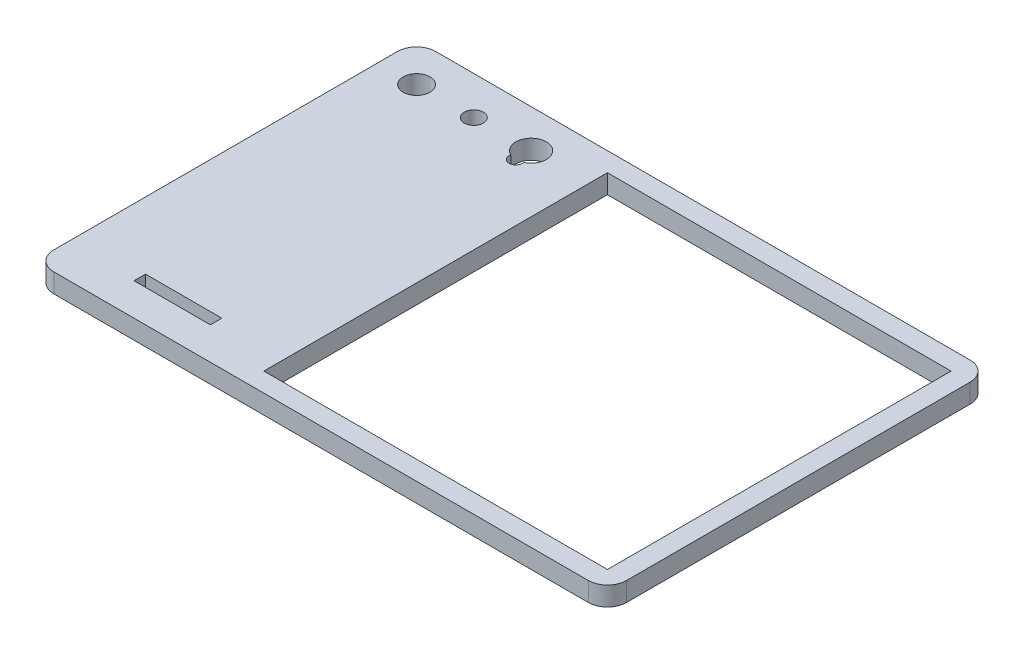
ISO-10303-21;
HEADER;
FILE_DESCRIPTION(('STEP AP214'),'2;1');
FILE_NAME('part.step','',(''),(''),'','','');
FILE_SCHEMA(('AUTOMOTIVE_DESIGN { 1 0 10303 214 1 1 1 1 }'));
ENDSEC;
DATA;
#1=APPLICATION_CONTEXT('core data for automotive mechanical design processes');
#2=APPLICATION_PROTOCOL_DEFINITION('international standard','automotive_design',2000,#1);
#3=PRODUCT_CONTEXT('',#1,'mechanical');
#4=PRODUCT('Part','Part','',(#3));
#5=PRODUCT_RELATED_PRODUCT_CATEGORY('part','',(#4));
#6=PRODUCT_DEFINITION_FORMATION('','',#4);
#7=PRODUCT_DEFINITION_CONTEXT('part definition',#1,'design');
#8=PRODUCT_DEFINITION('design','',#6,#7);
#9=PRODUCT_DEFINITION_SHAPE('','',#8);
#10=(LENGTH_UNIT() NAMED_UNIT(*) SI_UNIT(.MILLI.,.METRE.));
#11=(NAMED_UNIT(*) PLANE_ANGLE_UNIT() SI_UNIT($,.RADIAN.));
#12=(NAMED_UNIT(*) SI_UNIT($,.STERADIAN.) SOLID_ANGLE_UNIT());
#13=UNCERTAINTY_MEASURE_WITH_UNIT(LENGTH_MEASURE(1.E-05),#10,'distance_accuracy_value','');
#14=(GEOMETRIC_REPRESENTATION_CONTEXT(3) GLOBAL_UNCERTAINTY_ASSIGNED_CONTEXT((#13)) GLOBAL_UNIT_ASSIGNED_CONTEXT((#10,
#11,#12)) REPRESENTATION_CONTEXT('',''));
#15=CARTESIAN_POINT('',(0.,0.,0.));
#16=DIRECTION('',(0.,0.,1.));
#17=DIRECTION('',(1.,0.,0.));
#18=AXIS2_PLACEMENT_3D('',#15,#16,#17);
#19=CARTESIAN_POINT('',(0.,5.,0.));
#20=DIRECTION('',(0.,-1.,0.));
#21=DIRECTION('',(0.,0.,-1.));
#22=AXIS2_PLACEMENT_3D('',#19,#20,#21);
#23=PLANE('',#22);
#24=CARTESIAN_POINT('',(-65.,5.,-40.));
#25=DIRECTION('',(0.,1.,0.));
#26=DIRECTION('',(0.,0.,1.));
#27=AXIS2_PLACEMENT_3D('',#24,#25,#26);
#28=CIRCLE('',#27,3.5);
#29=CARTESIAN_POINT('',(-65.,5.,-36.5));
#30=VERTEX_POINT('',#29);
#31=EDGE_CURVE('E504',#30,#30,#28,.T.);
#32=ORIENTED_EDGE('',*,*,#31,.F.);
#33=EDGE_LOOP('',(#32));
#34=FACE_BOUND('',#33,.T.);
#35=CARTESIAN_POINT('',(-50.,5.,-40.));
#36=DIRECTION('',(0.,1.,0.));
#37=DIRECTION('',(0.,0.,1.));
#38=AXIS2_PLACEMENT_3D('',#35,#36,#37);
#39=CIRCLE('',#38,2.5);
#40=CARTESIAN_POINT('',(-50.,5.,-37.5));
#41=VERTEX_POINT('',#40);
#42=EDGE_CURVE('E178',#41,#41,#39,.T.);
#43=ORIENTED_EDGE('',*,*,#42,.F.);
#44=EDGE_LOOP('',(#43));
#45=FACE_BOUND('',#44,.T.);
#46=CARTESIAN_POINT('',(-35.,5.,-36.));
#47=DIRECTION('',(0.,1.,0.));
#48=DIRECTION('',(0.,0.,1.));
#49=AXIS2_PLACEMENT_3D('',#46,#47,#48);
#50=CIRCLE('',#49,1.75);
#51=CARTESIAN_POINT('',(-36.7076166401871,5.,-36.3828125));
#52=VERTEX_POINT('',#51);
#53=CARTESIAN_POINT('',(-33.2923833598129,5.,-36.3828125));
#54=VERTEX_POINT('',#53);
#55=EDGE_CURVE('E174',#52,#54,#50,.T.);
#56=ORIENTED_EDGE('',*,*,#55,.F.);
#57=CARTESIAN_POINT('',(-35.,5.,-40.));
#58=DIRECTION('',(0.,1.,0.));
#59=DIRECTION('',(0.,0.,1.));
#60=AXIS2_PLACEMENT_3D('',#57,#58,#59);
#61=CIRCLE('',#60,4.);
#62=EDGE_CURVE('E49',#54,#52,#61,.T.);
#63=ORIENTED_EDGE('',*,*,#62,.F.);
#64=EDGE_LOOP('',(#56,#63));
#65=FACE_BOUND('',#64,.T.);
#66=DIRECTION('',(0.,0.,-1.));
#67=VECTOR('',#66,1.);
#68=CARTESIAN_POINT('',(-37.5,5.,0.));
#69=LINE('',#68,#67);
#70=CARTESIAN_POINT('',(-37.5,5.,41.5));
#71=VERTEX_POINT('',#70);
#72=CARTESIAN_POINT('',(-37.5,5.,38.5));
#73=VERTEX_POINT('',#72);
#74=EDGE_CURVE('E198',#71,#73,#69,.T.);
#75=ORIENTED_EDGE('',*,*,#74,.F.);
#76=DIRECTION('',(1.,0.,0.));
#77=VECTOR('',#76,1.);
#78=CARTESIAN_POINT('',(0.,5.,41.5));
#79=LINE('',#78,#77);
#80=CARTESIAN_POINT('',(-57.5,5.,41.5));
#81=VERTEX_POINT('',#80);
#82=EDGE_CURVE('E57',#81,#71,#79,.T.);
#83=ORIENTED_EDGE('',*,*,#82,.F.);
#84=DIRECTION('',(0.,0.,-1.));
#85=VECTOR('',#84,1.);
#86=CARTESIAN_POINT('',(-57.5,5.,0.));
#87=LINE('',#86,#85);
#88=CARTESIAN_POINT('',(-57.5,5.,38.5));
#89=VERTEX_POINT('',#88);
#90=EDGE_CURVE('E188',#81,#89,#87,.T.);
#91=ORIENTED_EDGE('',*,*,#90,.T.);
#92=DIRECTION('',(1.,0.,0.));
#93=VECTOR('',#92,1.);
#94=CARTESIAN_POINT('',(0.,5.,38.5));
#95=LINE('',#94,#93);
#96=EDGE_CURVE('E201',#89,#73,#95,.T.);
#97=ORIENTED_EDGE('',*,*,#96,.T.);
#98=EDGE_LOOP('',(#75,#83,#91,#97));
#99=FACE_BOUND('',#98,.T.);
#100=DIRECTION('',(0.,0.,-1.));
#101=VECTOR('',#100,1.);
#102=CARTESIAN_POINT('',(75.,5.,50.));
#103=LINE('',#102,#101);
#104=CARTESIAN_POINT('',(75.,5.,45.));
#105=VERTEX_POINT('',#104);
#106=CARTESIAN_POINT('',(75.,5.,-45.));
#107=VERTEX_POINT('',#106);
#108=EDGE_CURVE('E245',#105,#107,#103,.T.);
#109=ORIENTED_EDGE('',*,*,#108,.T.);
#110=CARTESIAN_POINT('',(70.,5.,-45.));
#111=DIRECTION('',(0.,-1.,0.));
#112=DIRECTION('',(0.,0.,-1.));
#113=AXIS2_PLACEMENT_3D('',#110,#111,#112);
#114=CIRCLE('',#113,5.);
#115=CARTESIAN_POINT('',(70.,5.,-50.));
#116=VERTEX_POINT('',#115);
#117=EDGE_CURVE('E292',#107,#116,#114,.F.);
#118=ORIENTED_EDGE('',*,*,#117,.T.);
#119=DIRECTION('',(-1.,0.,0.));
#120=VECTOR('',#119,1.);
#121=CARTESIAN_POINT('',(-75.,5.,-50.));
#122=LINE('',#121,#120);
#123=CARTESIAN_POINT('',(-70.,5.,-50.));
#124=VERTEX_POINT('',#123);
#125=EDGE_CURVE('E248',#116,#124,#122,.T.);
#126=ORIENTED_EDGE('',*,*,#125,.T.);
#127=CARTESIAN_POINT('',(-70.,5.,-45.));
#128=DIRECTION('',(0.,-1.,0.));
#129=DIRECTION('',(0.,0.,-1.));
#130=AXIS2_PLACEMENT_3D('',#127,#128,#129);
#131=CIRCLE('',#130,5.);
#132=CARTESIAN_POINT('',(-75.,5.,-45.));
#133=VERTEX_POINT('',#132);
#134=EDGE_CURVE('E290',#124,#133,#131,.F.);
#135=ORIENTED_EDGE('',*,*,#134,.T.);
#136=DIRECTION('',(0.,0.,1.));
#137=VECTOR('',#136,1.);
#138=CARTESIAN_POINT('',(-75.,5.,50.));
#139=LINE('',#138,#137);
#140=CARTESIAN_POINT('',(-75.,5.,45.));
#141=VERTEX_POINT('',#140);
#142=EDGE_CURVE('E252',#133,#141,#139,.T.);
#143=ORIENTED_EDGE('',*,*,#142,.T.);
#144=CARTESIAN_POINT('',(-70.,5.,45.));
#145=DIRECTION('',(0.,-1.,0.));
#146=DIRECTION('',(0.,0.,-1.));
#147=AXIS2_PLACEMENT_3D('',#144,#145,#146);
#148=CIRCLE('',#147,5.);
#149=CARTESIAN_POINT('',(-70.,5.,50.));
#150=VERTEX_POINT('',#149);
#151=EDGE_CURVE('E288',#141,#150,#148,.F.);
#152=ORIENTED_EDGE('',*,*,#151,.T.);
#153=DIRECTION('',(1.,0.,0.));
#154=VECTOR('',#153,1.);
#155=CARTESIAN_POINT('',(-75.,5.,50.));
#156=LINE('',#155,#154);
#157=CARTESIAN_POINT('',(70.,5.,50.));
#158=VERTEX_POINT('',#157);
#159=EDGE_CURVE('E255',#150,#158,#156,.T.);
#160=ORIENTED_EDGE('',*,*,#159,.T.);
#161=CARTESIAN_POINT('',(70.,5.,45.));
#162=DIRECTION('',(0.,-1.,0.));
#163=DIRECTION('',(0.,0.,-1.));
#164=AXIS2_PLACEMENT_3D('',#161,#162,#163);
#165=CIRCLE('',#164,5.);
#166=EDGE_CURVE('E286',#158,#105,#165,.F.);
#167=ORIENTED_EDGE('',*,*,#166,.T.);
#168=EDGE_LOOP('',(#109,#118,#126,#135,#143,#152,#160,#167));
#169=FACE_BOUND('',#168,.T.);
#170=DIRECTION('',(0.,0.,-1.));
#171=VECTOR('',#170,1.);
#172=CARTESIAN_POINT('',(70.,5.,-45.));
#173=LINE('',#172,#171);
#174=CARTESIAN_POINT('',(70.,5.,45.));
#175=VERTEX_POINT('',#174);
#176=CARTESIAN_POINT('',(70.,5.,-45.));
#177=VERTEX_POINT('',#176);
#178=EDGE_CURVE('E212',#175,#177,#173,.T.);
#179=ORIENTED_EDGE('',*,*,#178,.F.);
#180=DIRECTION('',(1.,0.,0.));
#181=VECTOR('',#180,1.);
#182=CARTESIAN_POINT('',(70.,5.,45.));
#183=LINE('',#182,#181);
#184=CARTESIAN_POINT('',(-20.,5.,45.));
#185=VERTEX_POINT('',#184);
#186=EDGE_CURVE('E220',#185,#175,#183,.T.);
#187=ORIENTED_EDGE('',*,*,#186,.F.);
#188=DIRECTION('',(0.,0.,1.));
#189=VECTOR('',#188,1.);
#190=CARTESIAN_POINT('',(-20.,5.,-45.));
#191=LINE('',#190,#189);
#192=CARTESIAN_POINT('',(-20.,5.,-45.));
#193=VERTEX_POINT('',#192);
#194=EDGE_CURVE('E217',#193,#185,#191,.T.);
#195=ORIENTED_EDGE('',*,*,#194,.F.);
#196=DIRECTION('',(-1.,0.,0.));
#197=VECTOR('',#196,1.);
#198=CARTESIAN_POINT('',(70.,5.,-45.));
#199=LINE('',#198,#197);
#200=EDGE_CURVE('E214',#177,#193,#199,.T.);
#201=ORIENTED_EDGE('',*,*,#200,.F.);
#202=EDGE_LOOP('',(#179,#187,#195,#201));
#203=FACE_BOUND('',#202,.T.);
#204=ADVANCED_FACE('F34',(#34,#45,#65,#99,#169,#203),#23,.F.);
#205=CARTESIAN_POINT('',(0.,0.,0.));
#206=DIRECTION('',(0.,-1.,0.));
#207=DIRECTION('',(0.,0.,-1.));
#208=AXIS2_PLACEMENT_3D('',#205,#206,#207);
#209=PLANE('',#208);
#210=CARTESIAN_POINT('',(-65.,0.,-40.));
#211=DIRECTION('',(0.,1.,0.));
#212=DIRECTION('',(0.,0.,1.));
#213=AXIS2_PLACEMENT_3D('',#210,#211,#212);
#214=CIRCLE('',#213,3.5);
#215=CARTESIAN_POINT('',(-65.,0.,-36.5));
#216=VERTEX_POINT('',#215);
#217=EDGE_CURVE('E227',#216,#216,#214,.T.);
#218=ORIENTED_EDGE('',*,*,#217,.T.);
#219=EDGE_LOOP('',(#218));
#220=FACE_BOUND('',#219,.T.);
#221=CARTESIAN_POINT('',(-50.,0.,-40.));
#222=DIRECTION('',(0.,1.,0.));
#223=DIRECTION('',(0.,0.,1.));
#224=AXIS2_PLACEMENT_3D('',#221,#222,#223);
#225=CIRCLE('',#224,2.5);
#226=CARTESIAN_POINT('',(-50.,0.,-37.5));
#227=VERTEX_POINT('',#226);
#228=EDGE_CURVE('E505',#227,#227,#225,.T.);
#229=ORIENTED_EDGE('',*,*,#228,.T.);
#230=EDGE_LOOP('',(#229));
#231=FACE_BOUND('',#230,.T.);
#232=CARTESIAN_POINT('',(-35.,0.,-40.));
#233=DIRECTION('',(0.,1.,0.));
#234=DIRECTION('',(0.,0.,1.));
#235=AXIS2_PLACEMENT_3D('',#232,#233,#234);
#236=CIRCLE('',#235,4.);
#237=CARTESIAN_POINT('',(-33.2923833598129,0.,-36.3828125));
#238=VERTEX_POINT('',#237);
#239=CARTESIAN_POINT('',(-36.7076166401871,0.,-36.3828125));
#240=VERTEX_POINT('',#239);
#241=EDGE_CURVE('E160',#238,#240,#236,.T.);
#242=ORIENTED_EDGE('',*,*,#241,.T.);
#243=CARTESIAN_POINT('',(-35.,0.,-36.));
#244=DIRECTION('',(0.,1.,0.));
#245=DIRECTION('',(0.,0.,1.));
#246=AXIS2_PLACEMENT_3D('',#243,#244,#245);
#247=CIRCLE('',#246,1.75);
#248=EDGE_CURVE('E166',#240,#238,#247,.T.);
#249=ORIENTED_EDGE('',*,*,#248,.T.);
#250=EDGE_LOOP('',(#242,#249));
#251=FACE_BOUND('',#250,.T.);
#252=DIRECTION('',(1.,0.,0.));
#253=VECTOR('',#252,1.);
#254=CARTESIAN_POINT('',(0.,0.,41.5));
#255=LINE('',#254,#253);
#256=CARTESIAN_POINT('',(-57.5,0.,41.5));
#257=VERTEX_POINT('',#256);
#258=CARTESIAN_POINT('',(-37.5,0.,41.5));
#259=VERTEX_POINT('',#258);
#260=EDGE_CURVE('E184',#257,#259,#255,.T.);
#261=ORIENTED_EDGE('',*,*,#260,.T.);
#262=DIRECTION('',(0.,0.,-1.));
#263=VECTOR('',#262,1.);
#264=CARTESIAN_POINT('',(-37.5,0.,0.));
#265=LINE('',#264,#263);
#266=CARTESIAN_POINT('',(-37.5,0.,38.5));
#267=VERTEX_POINT('',#266);
#268=EDGE_CURVE('E187',#259,#267,#265,.T.);
#269=ORIENTED_EDGE('',*,*,#268,.T.);
#270=DIRECTION('',(1.,0.,0.));
#271=VECTOR('',#270,1.);
#272=CARTESIAN_POINT('',(0.,0.,38.5));
#273=LINE('',#272,#271);
#274=CARTESIAN_POINT('',(-57.5,0.,38.5));
#275=VERTEX_POINT('',#274);
#276=EDGE_CURVE('E191',#275,#267,#273,.T.);
#277=ORIENTED_EDGE('',*,*,#276,.F.);
#278=DIRECTION('',(0.,0.,-1.));
#279=VECTOR('',#278,1.);
#280=CARTESIAN_POINT('',(-57.5,0.,0.));
#281=LINE('',#280,#279);
#282=EDGE_CURVE('E194',#257,#275,#281,.T.);
#283=ORIENTED_EDGE('',*,*,#282,.F.);
#284=EDGE_LOOP('',(#261,#269,#277,#283));
#285=FACE_BOUND('',#284,.T.);
#286=DIRECTION('',(-1.,0.,0.));
#287=VECTOR('',#286,1.);
#288=CARTESIAN_POINT('',(-75.,0.,-50.));
#289=LINE('',#288,#287);
#290=CARTESIAN_POINT('',(70.,0.,-50.));
#291=VERTEX_POINT('',#290);
#292=CARTESIAN_POINT('',(-70.,0.,-50.));
#293=VERTEX_POINT('',#292);
#294=EDGE_CURVE('E261',#291,#293,#289,.T.);
#295=ORIENTED_EDGE('',*,*,#294,.F.);
#296=CARTESIAN_POINT('',(70.,0.,-45.));
#297=DIRECTION('',(0.,-1.,0.));
#298=DIRECTION('',(0.,0.,-1.));
#299=AXIS2_PLACEMENT_3D('',#296,#297,#298);
#300=CIRCLE('',#299,5.);
#301=CARTESIAN_POINT('',(75.,0.,-45.));
#302=VERTEX_POINT('',#301);
#303=EDGE_CURVE('E279',#291,#302,#300,.T.);
#304=ORIENTED_EDGE('',*,*,#303,.T.);
#305=DIRECTION('',(0.,0.,-1.));
#306=VECTOR('',#305,1.);
#307=CARTESIAN_POINT('',(75.,0.,50.));
#308=LINE('',#307,#306);
#309=CARTESIAN_POINT('',(75.,0.,45.));
#310=VERTEX_POINT('',#309);
#311=EDGE_CURVE('E244',#310,#302,#308,.T.);
#312=ORIENTED_EDGE('',*,*,#311,.F.);
#313=CARTESIAN_POINT('',(70.,0.,45.));
#314=DIRECTION('',(0.,-1.,0.));
#315=DIRECTION('',(0.,0.,-1.));
#316=AXIS2_PLACEMENT_3D('',#313,#314,#315);
#317=CIRCLE('',#316,5.);
#318=CARTESIAN_POINT('',(70.,0.,50.));
#319=VERTEX_POINT('',#318);
#320=EDGE_CURVE('E273',#310,#319,#317,.T.);
#321=ORIENTED_EDGE('',*,*,#320,.T.);
#322=DIRECTION('',(1.,0.,0.));
#323=VECTOR('',#322,1.);
#324=CARTESIAN_POINT('',(-75.,0.,50.));
#325=LINE('',#324,#323);
#326=CARTESIAN_POINT('',(-70.,0.,50.));
#327=VERTEX_POINT('',#326);
#328=EDGE_CURVE('E249',#327,#319,#325,.T.);
#329=ORIENTED_EDGE('',*,*,#328,.F.);
#330=CARTESIAN_POINT('',(-70.,0.,45.));
#331=DIRECTION('',(0.,-1.,0.));
#332=DIRECTION('',(0.,0.,-1.));
#333=AXIS2_PLACEMENT_3D('',#330,#331,#332);
#334=CIRCLE('',#333,5.);
#335=CARTESIAN_POINT('',(-75.,0.,45.));
#336=VERTEX_POINT('',#335);
#337=EDGE_CURVE('E275',#327,#336,#334,.T.);
#338=ORIENTED_EDGE('',*,*,#337,.T.);
#339=DIRECTION('',(0.,0.,1.));
#340=VECTOR('',#339,1.);
#341=CARTESIAN_POINT('',(-75.,0.,50.));
#342=LINE('',#341,#340);
#343=CARTESIAN_POINT('',(-75.,0.,-45.));
#344=VERTEX_POINT('',#343);
#345=EDGE_CURVE('E264',#344,#336,#342,.T.);
#346=ORIENTED_EDGE('',*,*,#345,.F.);
#347=CARTESIAN_POINT('',(-70.,0.,-45.));
#348=DIRECTION('',(0.,-1.,0.));
#349=DIRECTION('',(0.,0.,-1.));
#350=AXIS2_PLACEMENT_3D('',#347,#348,#349);
#351=CIRCLE('',#350,5.);
#352=EDGE_CURVE('E277',#344,#293,#351,.T.);
#353=ORIENTED_EDGE('',*,*,#352,.T.);
#354=EDGE_LOOP('',(#295,#304,#312,#321,#329,#338,#346,#353));
#355=FACE_BOUND('',#354,.T.);
#356=DIRECTION('',(1.,0.,0.));
#357=VECTOR('',#356,1.);
#358=CARTESIAN_POINT('',(70.,0.,45.));
#359=LINE('',#358,#357);
#360=CARTESIAN_POINT('',(-20.,0.,45.));
#361=VERTEX_POINT('',#360);
#362=CARTESIAN_POINT('',(70.,0.,45.));
#363=VERTEX_POINT('',#362);
#364=EDGE_CURVE('E215',#361,#363,#359,.T.);
#365=ORIENTED_EDGE('',*,*,#364,.T.);
#366=DIRECTION('',(0.,0.,-1.));
#367=VECTOR('',#366,1.);
#368=CARTESIAN_POINT('',(70.,0.,-45.));
#369=LINE('',#368,#367);
#370=CARTESIAN_POINT('',(70.,0.,-45.));
#371=VERTEX_POINT('',#370);
#372=EDGE_CURVE('E223',#363,#371,#369,.T.);
#373=ORIENTED_EDGE('',*,*,#372,.T.);
#374=DIRECTION('',(-1.,0.,0.));
#375=VECTOR('',#374,1.);
#376=CARTESIAN_POINT('',(70.,0.,-45.));
#377=LINE('',#376,#375);
#378=CARTESIAN_POINT('',(-20.,0.,-45.));
#379=VERTEX_POINT('',#378);
#380=EDGE_CURVE('E226',#371,#379,#377,.T.);
#381=ORIENTED_EDGE('',*,*,#380,.T.);
#382=DIRECTION('',(0.,0.,1.));
#383=VECTOR('',#382,1.);
#384=CARTESIAN_POINT('',(-20.,0.,-45.));
#385=LINE('',#384,#383);
#386=EDGE_CURVE('E230',#379,#361,#385,.T.);
#387=ORIENTED_EDGE('',*,*,#386,.T.);
#388=EDGE_LOOP('',(#365,#373,#381,#387));
#389=FACE_BOUND('',#388,.T.);
#390=ADVANCED_FACE('F172',(#220,#231,#251,#285,#355,#389),#209,.T.);
#391=CARTESIAN_POINT('',(75.,5.,50.));
#392=DIRECTION('',(-1.,0.,0.));
#393=DIRECTION('',(0.,0.,1.));
#394=AXIS2_PLACEMENT_3D('',#391,#392,#393);
#395=PLANE('',#394);
#396=ORIENTED_EDGE('',*,*,#311,.T.);
#397=DIRECTION('',(0.,-1.,0.));
#398=VECTOR('',#397,1.);
#399=CARTESIAN_POINT('',(75.,5.,-45.));
#400=LINE('',#399,#398);
#401=EDGE_CURVE('E284',#302,#107,#400,.F.);
#402=ORIENTED_EDGE('',*,*,#401,.T.);
#403=ORIENTED_EDGE('',*,*,#108,.F.);
#404=DIRECTION('',(0.,-1.,0.));
#405=VECTOR('',#404,1.);
#406=CARTESIAN_POINT('',(75.,5.,45.));
#407=LINE('',#406,#405);
#408=EDGE_CURVE('E281',#105,#310,#407,.T.);
#409=ORIENTED_EDGE('',*,*,#408,.T.);
#410=EDGE_LOOP('',(#396,#402,#403,#409));
#411=FACE_BOUND('',#410,.T.);
#412=ADVANCED_FACE('F313',(#411),#395,.F.);
#413=CARTESIAN_POINT('',(-75.,5.,-50.));
#414=DIRECTION('',(0.,0.,1.));
#415=DIRECTION('',(1.,0.,0.));
#416=AXIS2_PLACEMENT_3D('',#413,#414,#415);
#417=PLANE('',#416);
#418=ORIENTED_EDGE('',*,*,#125,.F.);
#419=DIRECTION('',(0.,-1.,0.));
#420=VECTOR('',#419,1.);
#421=CARTESIAN_POINT('',(70.,5.,-50.));
#422=LINE('',#421,#420);
#423=EDGE_CURVE('E270',#116,#291,#422,.T.);
#424=ORIENTED_EDGE('',*,*,#423,.T.);
#425=ORIENTED_EDGE('',*,*,#294,.T.);
#426=DIRECTION('',(0.,-1.,0.));
#427=VECTOR('',#426,1.);
#428=CARTESIAN_POINT('',(-70.,5.,-50.));
#429=LINE('',#428,#427);
#430=EDGE_CURVE('E258',#293,#124,#429,.F.);
#431=ORIENTED_EDGE('',*,*,#430,.T.);
#432=EDGE_LOOP('',(#418,#424,#425,#431));
#433=FACE_BOUND('',#432,.T.);
#434=ADVANCED_FACE('F324',(#433),#417,.F.);
#435=CARTESIAN_POINT('',(-75.,5.,50.));
#436=DIRECTION('',(1.,0.,0.));
#437=DIRECTION('',(0.,0.,-1.));
#438=AXIS2_PLACEMENT_3D('',#435,#436,#437);
#439=PLANE('',#438);
#440=ORIENTED_EDGE('',*,*,#142,.F.);
#441=DIRECTION('',(0.,-1.,0.));
#442=VECTOR('',#441,1.);
#443=CARTESIAN_POINT('',(-75.,5.,-45.));
#444=LINE('',#443,#442);
#445=EDGE_CURVE('E296',#133,#344,#444,.T.);
#446=ORIENTED_EDGE('',*,*,#445,.T.);
#447=ORIENTED_EDGE('',*,*,#345,.T.);
#448=DIRECTION('',(0.,-1.,0.));
#449=VECTOR('',#448,1.);
#450=CARTESIAN_POINT('',(-75.,5.,45.));
#451=LINE('',#450,#449);
#452=EDGE_CURVE('E294',#336,#141,#451,.F.);
#453=ORIENTED_EDGE('',*,*,#452,.T.);
#454=EDGE_LOOP('',(#440,#446,#447,#453));
#455=FACE_BOUND('',#454,.T.);
#456=ADVANCED_FACE('F333',(#455),#439,.F.);
#457=CARTESIAN_POINT('',(-75.,5.,50.));
#458=DIRECTION('',(0.,0.,-1.));
#459=DIRECTION('',(-1.,0.,0.));
#460=AXIS2_PLACEMENT_3D('',#457,#458,#459);
#461=PLANE('',#460);
#462=ORIENTED_EDGE('',*,*,#159,.F.);
#463=DIRECTION('',(0.,-1.,0.));
#464=VECTOR('',#463,1.);
#465=CARTESIAN_POINT('',(-70.,5.,50.));
#466=LINE('',#465,#464);
#467=EDGE_CURVE('E11',#150,#327,#466,.T.);
#468=ORIENTED_EDGE('',*,*,#467,.T.);
#469=ORIENTED_EDGE('',*,*,#328,.T.);
#470=DIRECTION('',(0.,-1.,0.));
#471=VECTOR('',#470,1.);
#472=CARTESIAN_POINT('',(70.,5.,50.));
#473=LINE('',#472,#471);
#474=EDGE_CURVE('E42',#319,#158,#473,.F.);
#475=ORIENTED_EDGE('',*,*,#474,.T.);
#476=EDGE_LOOP('',(#462,#468,#469,#475));
#477=FACE_BOUND('',#476,.T.);
#478=ADVANCED_FACE('F301',(#477),#461,.F.);
#479=CARTESIAN_POINT('',(70.,5.,-45.));
#480=DIRECTION('',(-1.,0.,0.));
#481=DIRECTION('',(0.,0.,1.));
#482=AXIS2_PLACEMENT_3D('',#479,#480,#481);
#483=PLANE('',#482);
#484=ORIENTED_EDGE('',*,*,#372,.F.);
#485=DIRECTION('',(0.,-1.,0.));
#486=VECTOR('',#485,1.);
#487=CARTESIAN_POINT('',(70.,5.,45.));
#488=LINE('',#487,#486);
#489=EDGE_CURVE('E222',#175,#363,#488,.T.);
#490=ORIENTED_EDGE('',*,*,#489,.F.);
#491=ORIENTED_EDGE('',*,*,#178,.T.);
#492=DIRECTION('',(0.,-1.,0.));
#493=VECTOR('',#492,1.);
#494=CARTESIAN_POINT('',(70.,5.,-45.));
#495=LINE('',#494,#493);
#496=EDGE_CURVE('E241',#177,#371,#495,.T.);
#497=ORIENTED_EDGE('',*,*,#496,.T.);
#498=EDGE_LOOP('',(#484,#490,#491,#497));
#499=FACE_BOUND('',#498,.T.);
#500=ADVANCED_FACE('F355',(#499),#483,.T.);
#501=CARTESIAN_POINT('',(70.,5.,-45.));
#502=DIRECTION('',(0.,0.,1.));
#503=DIRECTION('',(1.,0.,0.));
#504=AXIS2_PLACEMENT_3D('',#501,#502,#503);
#505=PLANE('',#504);
#506=ORIENTED_EDGE('',*,*,#380,.F.);
#507=ORIENTED_EDGE('',*,*,#496,.F.);
#508=ORIENTED_EDGE('',*,*,#200,.T.);
#509=DIRECTION('',(0.,-1.,0.));
#510=VECTOR('',#509,1.);
#511=CARTESIAN_POINT('',(-20.,5.,-45.));
#512=LINE('',#511,#510);
#513=EDGE_CURVE('E239',#193,#379,#512,.T.);
#514=ORIENTED_EDGE('',*,*,#513,.T.);
#515=EDGE_LOOP('',(#506,#507,#508,#514));
#516=FACE_BOUND('',#515,.T.);
#517=ADVANCED_FACE('F377',(#516),#505,.T.);
#518=CARTESIAN_POINT('',(-20.,5.,-45.));
#519=DIRECTION('',(1.,0.,0.));
#520=DIRECTION('',(0.,0.,-1.));
#521=AXIS2_PLACEMENT_3D('',#518,#519,#520);
#522=PLANE('',#521);
#523=ORIENTED_EDGE('',*,*,#386,.F.);
#524=ORIENTED_EDGE('',*,*,#513,.F.);
#525=ORIENTED_EDGE('',*,*,#194,.T.);
#526=DIRECTION('',(0.,-1.,0.));
#527=VECTOR('',#526,1.);
#528=CARTESIAN_POINT('',(-20.,5.,45.));
#529=LINE('',#528,#527);
#530=EDGE_CURVE('E237',#185,#361,#529,.T.);
#531=ORIENTED_EDGE('',*,*,#530,.T.);
#532=EDGE_LOOP('',(#523,#524,#525,#531));
#533=FACE_BOUND('',#532,.T.);
#534=ADVANCED_FACE('F371',(#533),#522,.T.);
#535=CARTESIAN_POINT('',(70.,5.,45.));
#536=DIRECTION('',(0.,0.,-1.));
#537=DIRECTION('',(-1.,0.,0.));
#538=AXIS2_PLACEMENT_3D('',#535,#536,#537);
#539=PLANE('',#538);
#540=ORIENTED_EDGE('',*,*,#364,.F.);
#541=ORIENTED_EDGE('',*,*,#530,.F.);
#542=ORIENTED_EDGE('',*,*,#186,.T.);
#543=ORIENTED_EDGE('',*,*,#489,.T.);
#544=EDGE_LOOP('',(#540,#541,#542,#543));
#545=FACE_BOUND('',#544,.T.);
#546=ADVANCED_FACE('F367',(#545),#539,.T.);
#547=CARTESIAN_POINT('',(70.,5.,-45.));
#548=DIRECTION('',(0.,-1.,0.));
#549=DIRECTION('',(0.,0.,-1.));
#550=AXIS2_PLACEMENT_3D('',#547,#548,#549);
#551=CYLINDRICAL_SURFACE('',#550,5.);
#552=ORIENTED_EDGE('',*,*,#117,.F.);
#553=ORIENTED_EDGE('',*,*,#401,.F.);
#554=ORIENTED_EDGE('',*,*,#303,.F.);
#555=ORIENTED_EDGE('',*,*,#423,.F.);
#556=EDGE_LOOP('',(#552,#553,#554,#555));
#557=FACE_BOUND('',#556,.T.);
#558=ADVANCED_FACE('F321',(#557),#551,.T.);
#559=CARTESIAN_POINT('',(-70.,5.,-45.));
#560=DIRECTION('',(0.,-1.,0.));
#561=DIRECTION('',(0.,0.,-1.));
#562=AXIS2_PLACEMENT_3D('',#559,#560,#561);
#563=CYLINDRICAL_SURFACE('',#562,5.);
#564=ORIENTED_EDGE('',*,*,#134,.F.);
#565=ORIENTED_EDGE('',*,*,#430,.F.);
#566=ORIENTED_EDGE('',*,*,#352,.F.);
#567=ORIENTED_EDGE('',*,*,#445,.F.);
#568=EDGE_LOOP('',(#564,#565,#566,#567));
#569=FACE_BOUND('',#568,.T.);
#570=ADVANCED_FACE('F330',(#569),#563,.T.);
#571=CARTESIAN_POINT('',(-70.,5.,45.));
#572=DIRECTION('',(0.,-1.,0.));
#573=DIRECTION('',(0.,0.,-1.));
#574=AXIS2_PLACEMENT_3D('',#571,#572,#573);
#575=CYLINDRICAL_SURFACE('',#574,5.);
#576=ORIENTED_EDGE('',*,*,#151,.F.);
#577=ORIENTED_EDGE('',*,*,#452,.F.);
#578=ORIENTED_EDGE('',*,*,#337,.F.);
#579=ORIENTED_EDGE('',*,*,#467,.F.);
#580=EDGE_LOOP('',(#576,#577,#578,#579));
#581=FACE_BOUND('',#580,.T.);
#582=ADVANCED_FACE('F336',(#581),#575,.T.);
#583=CARTESIAN_POINT('',(70.,5.,45.));
#584=DIRECTION('',(0.,-1.,0.));
#585=DIRECTION('',(0.,0.,-1.));
#586=AXIS2_PLACEMENT_3D('',#583,#584,#585);
#587=CYLINDRICAL_SURFACE('',#586,5.);
#588=ORIENTED_EDGE('',*,*,#166,.F.);
#589=ORIENTED_EDGE('',*,*,#474,.F.);
#590=ORIENTED_EDGE('',*,*,#320,.F.);
#591=ORIENTED_EDGE('',*,*,#408,.F.);
#592=EDGE_LOOP('',(#588,#589,#590,#591));
#593=FACE_BOUND('',#592,.T.);
#594=ADVANCED_FACE('F36',(#593),#587,.T.);
#595=CARTESIAN_POINT('',(0.,0.,41.5));
#596=DIRECTION('',(0.,0.,1.));
#597=DIRECTION('',(1.,0.,0.));
#598=AXIS2_PLACEMENT_3D('',#595,#596,#597);
#599=PLANE('',#598);
#600=ORIENTED_EDGE('',*,*,#82,.T.);
#601=DIRECTION('',(0.,1.,0.));
#602=VECTOR('',#601,1.);
#603=CARTESIAN_POINT('',(-37.5,0.,41.5));
#604=LINE('',#603,#602);
#605=EDGE_CURVE('E196',#259,#71,#604,.T.);
#606=ORIENTED_EDGE('',*,*,#605,.F.);
#607=ORIENTED_EDGE('',*,*,#260,.F.);
#608=DIRECTION('',(0.,1.,0.));
#609=VECTOR('',#608,1.);
#610=CARTESIAN_POINT('',(-57.5,0.,41.5));
#611=LINE('',#610,#609);
#612=EDGE_CURVE('E181',#257,#81,#611,.T.);
#613=ORIENTED_EDGE('',*,*,#612,.T.);
#614=EDGE_LOOP('',(#600,#606,#607,#613));
#615=FACE_BOUND('',#614,.T.);
#616=ADVANCED_FACE('F342',(#615),#599,.F.);
#617=CARTESIAN_POINT('',(-57.5,0.,0.));
#618=DIRECTION('',(1.,0.,0.));
#619=DIRECTION('',(0.,0.,-1.));
#620=AXIS2_PLACEMENT_3D('',#617,#618,#619);
#621=PLANE('',#620);
#622=ORIENTED_EDGE('',*,*,#90,.F.);
#623=ORIENTED_EDGE('',*,*,#612,.F.);
#624=ORIENTED_EDGE('',*,*,#282,.T.);
#625=DIRECTION('',(0.,1.,0.));
#626=VECTOR('',#625,1.);
#627=CARTESIAN_POINT('',(-57.5,0.,38.5));
#628=LINE('',#627,#626);
#629=EDGE_CURVE('E207',#275,#89,#628,.T.);
#630=ORIENTED_EDGE('',*,*,#629,.T.);
#631=EDGE_LOOP('',(#622,#623,#624,#630));
#632=FACE_BOUND('',#631,.T.);
#633=ADVANCED_FACE('F432',(#632),#621,.T.);
#634=CARTESIAN_POINT('',(0.,0.,38.5));
#635=DIRECTION('',(0.,0.,1.));
#636=DIRECTION('',(1.,0.,0.));
#637=AXIS2_PLACEMENT_3D('',#634,#635,#636);
#638=PLANE('',#637);
#639=ORIENTED_EDGE('',*,*,#96,.F.);
#640=ORIENTED_EDGE('',*,*,#629,.F.);
#641=ORIENTED_EDGE('',*,*,#276,.T.);
#642=DIRECTION('',(0.,1.,0.));
#643=VECTOR('',#642,1.);
#644=CARTESIAN_POINT('',(-37.5,0.,38.5));
#645=LINE('',#644,#643);
#646=EDGE_CURVE('E209',#267,#73,#645,.T.);
#647=ORIENTED_EDGE('',*,*,#646,.T.);
#648=EDGE_LOOP('',(#639,#640,#641,#647));
#649=FACE_BOUND('',#648,.T.);
#650=ADVANCED_FACE('F441',(#649),#638,.T.);
#651=CARTESIAN_POINT('',(-37.5,0.,0.));
#652=DIRECTION('',(1.,0.,0.));
#653=DIRECTION('',(0.,0.,-1.));
#654=AXIS2_PLACEMENT_3D('',#651,#652,#653);
#655=PLANE('',#654);
#656=ORIENTED_EDGE('',*,*,#74,.T.);
#657=ORIENTED_EDGE('',*,*,#646,.F.);
#658=ORIENTED_EDGE('',*,*,#268,.F.);
#659=ORIENTED_EDGE('',*,*,#605,.T.);
#660=EDGE_LOOP('',(#656,#657,#658,#659));
#661=FACE_BOUND('',#660,.T.);
#662=ADVANCED_FACE('F451',(#661),#655,.F.);
#663=CARTESIAN_POINT('',(-35.,0.,-40.));
#664=DIRECTION('',(0.,1.,0.));
#665=DIRECTION('',(0.,0.,1.));
#666=AXIS2_PLACEMENT_3D('',#663,#664,#665);
#667=CYLINDRICAL_SURFACE('',#666,4.);
#668=ORIENTED_EDGE('',*,*,#62,.T.);
#669=DIRECTION('',(0.,1.,0.));
#670=VECTOR('',#669,1.);
#671=CARTESIAN_POINT('',(-36.7076166401871,0.,-36.3828125));
#672=LINE('',#671,#670);
#673=EDGE_CURVE('E156',#240,#52,#672,.T.);
#674=ORIENTED_EDGE('',*,*,#673,.F.);
#675=ORIENTED_EDGE('',*,*,#241,.F.);
#676=DIRECTION('',(0.,1.,0.));
#677=VECTOR('',#676,1.);
#678=CARTESIAN_POINT('',(-33.2923833598129,0.,-36.3828125));
#679=LINE('',#678,#677);
#680=EDGE_CURVE('E165',#238,#54,#679,.T.);
#681=ORIENTED_EDGE('',*,*,#680,.T.);
#682=EDGE_LOOP('',(#668,#674,#675,#681));
#683=FACE_BOUND('',#682,.T.);
#684=ADVANCED_FACE('F158',(#683),#667,.F.);
#685=CARTESIAN_POINT('',(-35.,0.,-36.));
#686=DIRECTION('',(0.,1.,0.));
#687=DIRECTION('',(0.,0.,1.));
#688=AXIS2_PLACEMENT_3D('',#685,#686,#687);
#689=CYLINDRICAL_SURFACE('',#688,1.75);
#690=ORIENTED_EDGE('',*,*,#55,.T.);
#691=ORIENTED_EDGE('',*,*,#680,.F.);
#692=ORIENTED_EDGE('',*,*,#248,.F.);
#693=ORIENTED_EDGE('',*,*,#673,.T.);
#694=EDGE_LOOP('',(#690,#691,#692,#693));
#695=FACE_BOUND('',#694,.T.);
#696=ADVANCED_FACE('F169',(#695),#689,.F.);
#697=CARTESIAN_POINT('',(-50.,0.,-40.));
#698=DIRECTION('',(0.,1.,0.));
#699=DIRECTION('',(0.,0.,1.));
#700=AXIS2_PLACEMENT_3D('',#697,#698,#699);
#701=CYLINDRICAL_SURFACE('',#700,2.5);
#702=ORIENTED_EDGE('',*,*,#228,.F.);
#703=EDGE_LOOP('',(#702));
#704=FACE_BOUND('',#703,.T.);
#705=ORIENTED_EDGE('',*,*,#42,.T.);
#706=EDGE_LOOP('',(#705));
#707=FACE_BOUND('',#706,.T.);
#708=ADVANCED_FACE('F477',(#704,#707),#701,.F.);
#709=CARTESIAN_POINT('',(-65.,0.,-40.));
#710=DIRECTION('',(0.,1.,0.));
#711=DIRECTION('',(0.,0.,1.));
#712=AXIS2_PLACEMENT_3D('',#709,#710,#711);
#713=CYLINDRICAL_SURFACE('',#712,3.5);
#714=ORIENTED_EDGE('',*,*,#217,.F.);
#715=EDGE_LOOP('',(#714));
#716=FACE_BOUND('',#715,.T.);
#717=ORIENTED_EDGE('',*,*,#31,.T.);
#718=EDGE_LOOP('',(#717));
#719=FACE_BOUND('',#718,.T.);
#720=ADVANCED_FACE('F486',(#716,#719),#713,.F.);
#721=CLOSED_SHELL('',(#204,#390,#412,#434,#456,#478,#500,#517,#534,#546,#558,#570,#582,#594,
#616,#633,#650,#662,#684,#696,#708,#720));
#722=MANIFOLD_SOLID_BREP('B2',#721);
#723=ADVANCED_BREP_SHAPE_REPRESENTATION('',(#18,#722),#14);
#724=SHAPE_DEFINITION_REPRESENTATION(#9,#723);
ENDSEC;
END-ISO-10303-21;
